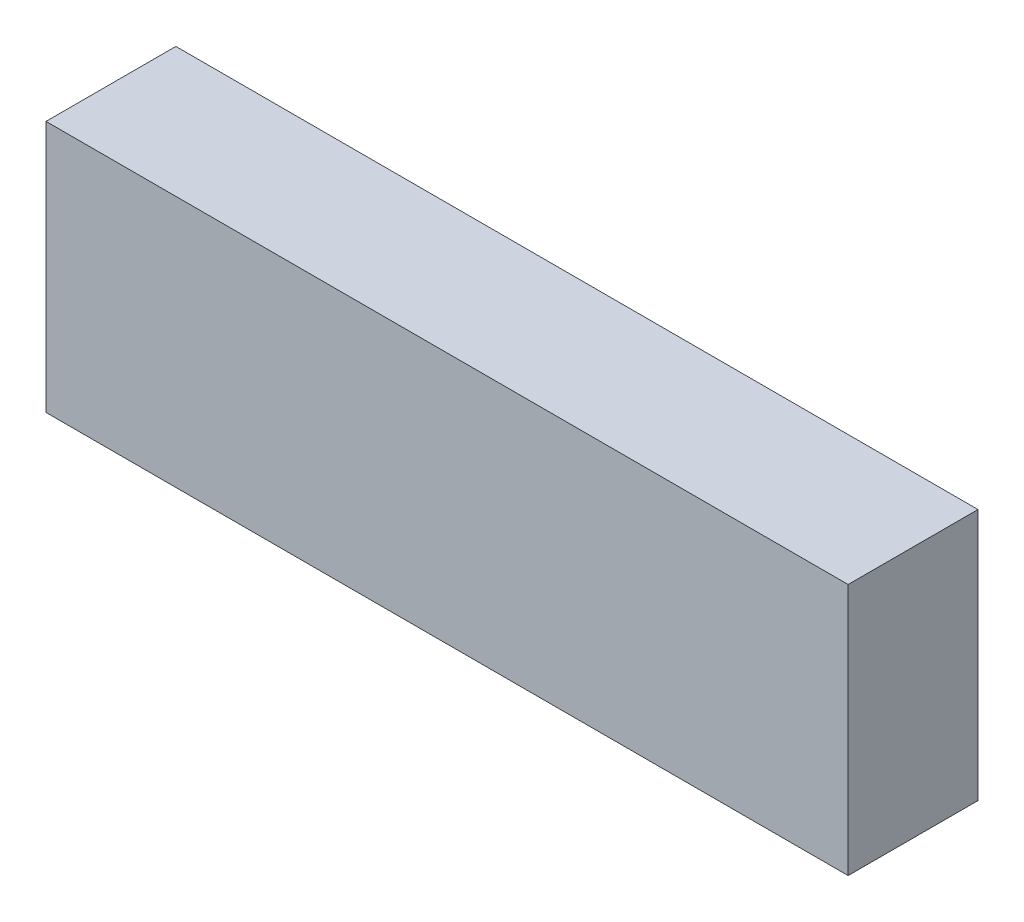
ISO-10303-21;
HEADER;
FILE_DESCRIPTION(('STEP AP214'),'2;1');
FILE_NAME('part.step','',(''),(''),'','','');
FILE_SCHEMA(('AUTOMOTIVE_DESIGN { 1 0 10303 214 1 1 1 1 }'));
ENDSEC;
DATA;
#1=APPLICATION_CONTEXT('core data for automotive mechanical design processes');
#2=APPLICATION_PROTOCOL_DEFINITION('international standard','automotive_design',2000,#1);
#3=PRODUCT_CONTEXT('',#1,'mechanical');
#4=PRODUCT('Part','Part','',(#3));
#5=PRODUCT_RELATED_PRODUCT_CATEGORY('part','',(#4));
#6=PRODUCT_DEFINITION_FORMATION('','',#4);
#7=PRODUCT_DEFINITION_CONTEXT('part definition',#1,'design');
#8=PRODUCT_DEFINITION('design','',#6,#7);
#9=PRODUCT_DEFINITION_SHAPE('','',#8);
#10=(LENGTH_UNIT() NAMED_UNIT(*) SI_UNIT(.MILLI.,.METRE.));
#11=(NAMED_UNIT(*) PLANE_ANGLE_UNIT() SI_UNIT($,.RADIAN.));
#12=(NAMED_UNIT(*) SI_UNIT($,.STERADIAN.) SOLID_ANGLE_UNIT());
#13=UNCERTAINTY_MEASURE_WITH_UNIT(LENGTH_MEASURE(1.E-05),#10,'distance_accuracy_value','');
#14=(GEOMETRIC_REPRESENTATION_CONTEXT(3) GLOBAL_UNCERTAINTY_ASSIGNED_CONTEXT((#13)) GLOBAL_UNIT_ASSIGNED_CONTEXT((#10,
#11,#12)) REPRESENTATION_CONTEXT('',''));
#15=CARTESIAN_POINT('',(0.,0.,0.));
#16=DIRECTION('',(0.,0.,1.));
#17=DIRECTION('',(1.,0.,0.));
#18=AXIS2_PLACEMENT_3D('',#15,#16,#17);
#19=CARTESIAN_POINT('',(52.5,-16.5,17.));
#20=DIRECTION('',(-1.,0.,0.));
#21=DIRECTION('',(0.,0.,1.));
#22=AXIS2_PLACEMENT_3D('',#19,#20,#21);
#23=PLANE('',#22);
#24=DIRECTION('',(0.,1.,0.));
#25=VECTOR('',#24,1.);
#26=CARTESIAN_POINT('',(52.5,-16.5,0.));
#27=LINE('',#26,#25);
#28=CARTESIAN_POINT('',(52.5,-16.5,0.));
#29=VERTEX_POINT('',#28);
#30=CARTESIAN_POINT('',(52.5,16.5,0.));
#31=VERTEX_POINT('',#30);
#32=EDGE_CURVE('E93',#29,#31,#27,.T.);
#33=ORIENTED_EDGE('',*,*,#32,.T.);
#34=DIRECTION('',(0.,0.,-1.));
#35=VECTOR('',#34,1.);
#36=CARTESIAN_POINT('',(52.5,16.5,17.));
#37=LINE('',#36,#35);
#38=CARTESIAN_POINT('',(52.5,16.5,17.));
#39=VERTEX_POINT('',#38);
#40=EDGE_CURVE('E11',#39,#31,#37,.T.);
#41=ORIENTED_EDGE('',*,*,#40,.F.);
#42=DIRECTION('',(0.,1.,0.));
#43=VECTOR('',#42,1.);
#44=CARTESIAN_POINT('',(52.5,-16.5,17.));
#45=LINE('',#44,#43);
#46=CARTESIAN_POINT('',(52.5,-16.5,17.));
#47=VERTEX_POINT('',#46);
#48=EDGE_CURVE('E81',#47,#39,#45,.T.);
#49=ORIENTED_EDGE('',*,*,#48,.F.);
#50=DIRECTION('',(0.,0.,-1.));
#51=VECTOR('',#50,1.);
#52=CARTESIAN_POINT('',(52.5,-16.5,17.));
#53=LINE('',#52,#51);
#54=EDGE_CURVE('E89',#47,#29,#53,.T.);
#55=ORIENTED_EDGE('',*,*,#54,.T.);
#56=EDGE_LOOP('',(#33,#41,#49,#55));
#57=FACE_BOUND('',#56,.T.);
#58=ADVANCED_FACE('F30',(#57),#23,.F.);
#59=CARTESIAN_POINT('',(-52.5,16.5,17.));
#60=DIRECTION('',(0.,-1.,0.));
#61=DIRECTION('',(0.,0.,-1.));
#62=AXIS2_PLACEMENT_3D('',#59,#60,#61);
#63=PLANE('',#62);
#64=DIRECTION('',(-1.,0.,0.));
#65=VECTOR('',#64,1.);
#66=CARTESIAN_POINT('',(-52.5,16.5,0.));
#67=LINE('',#66,#65);
#68=CARTESIAN_POINT('',(-52.5,16.5,0.));
#69=VERTEX_POINT('',#68);
#70=EDGE_CURVE('E85',#31,#69,#67,.T.);
#71=ORIENTED_EDGE('',*,*,#70,.T.);
#72=DIRECTION('',(0.,0.,-1.));
#73=VECTOR('',#72,1.);
#74=CARTESIAN_POINT('',(-52.5,16.5,17.));
#75=LINE('',#74,#73);
#76=CARTESIAN_POINT('',(-52.5,16.5,17.));
#77=VERTEX_POINT('',#76);
#78=EDGE_CURVE('E38',#77,#69,#75,.T.);
#79=ORIENTED_EDGE('',*,*,#78,.F.);
#80=DIRECTION('',(-1.,0.,0.));
#81=VECTOR('',#80,1.);
#82=CARTESIAN_POINT('',(-52.5,16.5,17.));
#83=LINE('',#82,#81);
#84=EDGE_CURVE('E76',#39,#77,#83,.T.);
#85=ORIENTED_EDGE('',*,*,#84,.F.);
#86=ORIENTED_EDGE('',*,*,#40,.T.);
#87=EDGE_LOOP('',(#71,#79,#85,#86));
#88=FACE_BOUND('',#87,.T.);
#89=ADVANCED_FACE('F84',(#88),#63,.F.);
#90=CARTESIAN_POINT('',(-52.5,-16.5,17.));
#91=DIRECTION('',(1.,0.,0.));
#92=DIRECTION('',(0.,0.,-1.));
#93=AXIS2_PLACEMENT_3D('',#90,#91,#92);
#94=PLANE('',#93);
#95=DIRECTION('',(0.,-1.,0.));
#96=VECTOR('',#95,1.);
#97=CARTESIAN_POINT('',(-52.5,-16.5,0.));
#98=LINE('',#97,#96);
#99=CARTESIAN_POINT('',(-52.5,-16.5,0.));
#100=VERTEX_POINT('',#99);
#101=EDGE_CURVE('E63',#69,#100,#98,.T.);
#102=ORIENTED_EDGE('',*,*,#101,.T.);
#103=DIRECTION('',(0.,0.,-1.));
#104=VECTOR('',#103,1.);
#105=CARTESIAN_POINT('',(-52.5,-16.5,17.));
#106=LINE('',#105,#104);
#107=CARTESIAN_POINT('',(-52.5,-16.5,17.));
#108=VERTEX_POINT('',#107);
#109=EDGE_CURVE('E86',#108,#100,#106,.T.);
#110=ORIENTED_EDGE('',*,*,#109,.F.);
#111=DIRECTION('',(0.,-1.,0.));
#112=VECTOR('',#111,1.);
#113=CARTESIAN_POINT('',(-52.5,-16.5,17.));
#114=LINE('',#113,#112);
#115=EDGE_CURVE('E79',#77,#108,#114,.T.);
#116=ORIENTED_EDGE('',*,*,#115,.F.);
#117=ORIENTED_EDGE('',*,*,#78,.T.);
#118=EDGE_LOOP('',(#102,#110,#116,#117));
#119=FACE_BOUND('',#118,.T.);
#120=ADVANCED_FACE('F87',(#119),#94,.F.);
#121=CARTESIAN_POINT('',(-52.5,-16.5,17.));
#122=DIRECTION('',(0.,1.,0.));
#123=DIRECTION('',(0.,0.,1.));
#124=AXIS2_PLACEMENT_3D('',#121,#122,#123);
#125=PLANE('',#124);
#126=DIRECTION('',(1.,0.,0.));
#127=VECTOR('',#126,1.);
#128=CARTESIAN_POINT('',(-52.5,-16.5,0.));
#129=LINE('',#128,#127);
#130=EDGE_CURVE('E69',#100,#29,#129,.T.);
#131=ORIENTED_EDGE('',*,*,#130,.T.);
#132=ORIENTED_EDGE('',*,*,#54,.F.);
#133=DIRECTION('',(1.,0.,0.));
#134=VECTOR('',#133,1.);
#135=CARTESIAN_POINT('',(-52.5,-16.5,17.));
#136=LINE('',#135,#134);
#137=EDGE_CURVE('E46',#108,#47,#136,.T.);
#138=ORIENTED_EDGE('',*,*,#137,.F.);
#139=ORIENTED_EDGE('',*,*,#109,.T.);
#140=EDGE_LOOP('',(#131,#132,#138,#139));
#141=FACE_BOUND('',#140,.T.);
#142=ADVANCED_FACE('F100',(#141),#125,.F.);
#143=CARTESIAN_POINT('',(52.5,16.5,17.));
#144=DIRECTION('',(0.,0.,-1.));
#145=DIRECTION('',(-1.,0.,0.));
#146=AXIS2_PLACEMENT_3D('',#143,#144,#145);
#147=PLANE('',#146);
#148=ORIENTED_EDGE('',*,*,#48,.T.);
#149=ORIENTED_EDGE('',*,*,#84,.T.);
#150=ORIENTED_EDGE('',*,*,#115,.T.);
#151=ORIENTED_EDGE('',*,*,#137,.T.);
#152=EDGE_LOOP('',(#148,#149,#150,#151));
#153=FACE_BOUND('',#152,.T.);
#154=ADVANCED_FACE('F77',(#153),#147,.F.);
#155=CARTESIAN_POINT('',(52.5,16.5,0.));
#156=DIRECTION('',(0.,0.,-1.));
#157=DIRECTION('',(-1.,0.,0.));
#158=AXIS2_PLACEMENT_3D('',#155,#156,#157);
#159=PLANE('',#158);
#160=ORIENTED_EDGE('',*,*,#32,.F.);
#161=ORIENTED_EDGE('',*,*,#130,.F.);
#162=ORIENTED_EDGE('',*,*,#101,.F.);
#163=ORIENTED_EDGE('',*,*,#70,.F.);
#164=EDGE_LOOP('',(#160,#161,#162,#163));
#165=FACE_BOUND('',#164,.T.);
#166=ADVANCED_FACE('F103',(#165),#159,.T.);
#167=CLOSED_SHELL('',(#58,#89,#120,#142,#154,#166));
#168=MANIFOLD_SOLID_BREP('B2',#167);
#169=ADVANCED_BREP_SHAPE_REPRESENTATION('',(#18,#168),#14);
#170=SHAPE_DEFINITION_REPRESENTATION(#9,#169);
ENDSEC;
END-ISO-10303-21;
